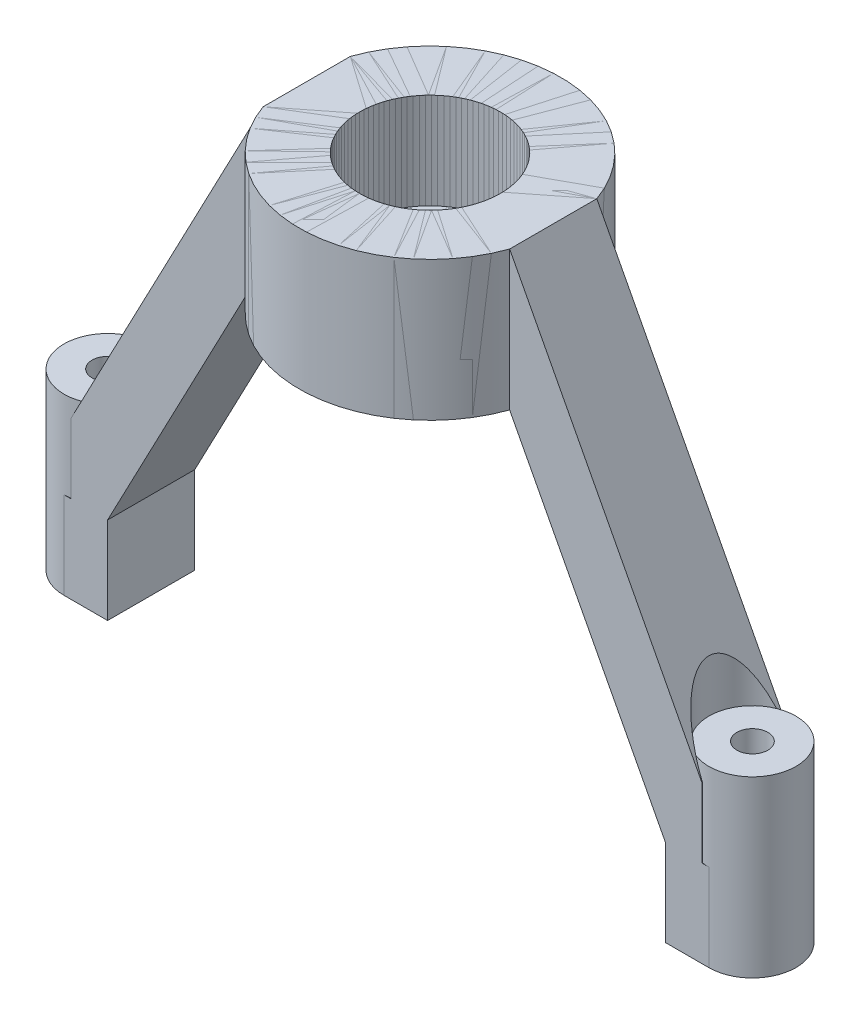
ISO-10303-21;
HEADER;
FILE_DESCRIPTION(('STEP AP214'),'2;1');
FILE_NAME('part.step','',(''),(''),'','','');
FILE_SCHEMA(('AUTOMOTIVE_DESIGN { 1 0 10303 214 1 1 1 1 }'));
ENDSEC;
DATA;
#1=APPLICATION_CONTEXT('core data for automotive mechanical design processes');
#2=APPLICATION_PROTOCOL_DEFINITION('international standard','automotive_design',2000,#1);
#3=PRODUCT_CONTEXT('',#1,'mechanical');
#4=PRODUCT('Part','Part','',(#3));
#5=PRODUCT_RELATED_PRODUCT_CATEGORY('part','',(#4));
#6=PRODUCT_DEFINITION_FORMATION('','',#4);
#7=PRODUCT_DEFINITION_CONTEXT('part definition',#1,'design');
#8=PRODUCT_DEFINITION('design','',#6,#7);
#9=PRODUCT_DEFINITION_SHAPE('','',#8);
#10=(LENGTH_UNIT() NAMED_UNIT(*) SI_UNIT(.MILLI.,.METRE.));
#11=(NAMED_UNIT(*) PLANE_ANGLE_UNIT() SI_UNIT($,.RADIAN.));
#12=(NAMED_UNIT(*) SI_UNIT($,.STERADIAN.) SOLID_ANGLE_UNIT());
#13=UNCERTAINTY_MEASURE_WITH_UNIT(LENGTH_MEASURE(1.E-05),#10,'distance_accuracy_value','');
#14=(GEOMETRIC_REPRESENTATION_CONTEXT(3) GLOBAL_UNCERTAINTY_ASSIGNED_CONTEXT((#13)) GLOBAL_UNIT_ASSIGNED_CONTEXT((#10,
#11,#12)) REPRESENTATION_CONTEXT('',''));
#15=CARTESIAN_POINT('',(0.,0.,0.));
#16=DIRECTION('',(0.,0.,1.));
#17=DIRECTION('',(1.,0.,0.));
#18=AXIS2_PLACEMENT_3D('',#15,#16,#17);
#19=CARTESIAN_POINT('',(7.07106781186548,8.,2.5));
#20=DIRECTION('',(0.885313609398567,0.464994422561907,0.));
#21=DIRECTION('',(0.464994422561907,-0.885313609398567,0.));
#22=AXIS2_PLACEMENT_3D('',#19,#20,#21);
#23=PLANE('',#22);
#24=CARTESIAN_POINT('',(18.5,-13.7598076796324,0.));
#25=DIRECTION('',(0.885313609398567,0.464994422561907,0.));
#26=DIRECTION('',(0.464994422561907,-0.885313609398567,0.));
#27=AXIS2_PLACEMENT_3D('',#24,#25,#26);
#28=ELLIPSE('',#27,5.37640857330318,2.5);
#29=CARTESIAN_POINT('',(17.5756939155531,-12.,2.32285562664892));
#30=VERTEX_POINT('',#29);
#31=CARTESIAN_POINT('',(18.0982681457173,-12.9949411335653,2.467511199013));
#32=VERTEX_POINT('',#31);
#33=EDGE_CURVE('E477',#30,#32,#28,.T.);
#34=ORIENTED_EDGE('',*,*,#33,.F.);
#35=CARTESIAN_POINT('',(18.5,-13.7598076796324,0.));
#36=DIRECTION('',(0.885313609398567,0.464994422561907,0.));
#37=DIRECTION('',(0.464994422561907,-0.885313609398567,0.));
#38=AXIS2_PLACEMENT_3D('',#35,#36,#37);
#39=ELLIPSE('',#38,5.37640857330318,2.5);
#40=CARTESIAN_POINT('',(17.5756939155531,-12.,-2.32285562664892));
#41=VERTEX_POINT('',#40);
#42=EDGE_CURVE('E12',#30,#41,#39,.F.);
#43=ORIENTED_EDGE('',*,*,#42,.T.);
#44=CARTESIAN_POINT('',(18.0982681457173,-12.9949411335653,-2.467511199013));
#45=VERTEX_POINT('',#44);
#46=EDGE_CURVE('E475',#45,#41,#28,.T.);
#47=ORIENTED_EDGE('',*,*,#46,.F.);
#48=DIRECTION('',(0.,0.,-1.));
#49=VECTOR('',#48,1.);
#50=CARTESIAN_POINT('',(18.0982681457173,-12.9949411335653,2.5));
#51=LINE('',#50,#49);
#52=CARTESIAN_POINT('',(18.0982681457173,-12.9949411335653,-2.5));
#53=VERTEX_POINT('',#52);
#54=EDGE_CURVE('E490',#45,#53,#51,.T.);
#55=ORIENTED_EDGE('',*,*,#54,.T.);
#56=DIRECTION('',(0.464994422561907,-0.885313609398567,0.));
#57=VECTOR('',#56,1.);
#58=CARTESIAN_POINT('',(7.07106781186548,8.,-2.5));
#59=LINE('',#58,#57);
#60=CARTESIAN_POINT('',(7.07106781186548,8.,-2.5));
#61=VERTEX_POINT('',#60);
#62=EDGE_CURVE('E495',#61,#53,#59,.T.);
#63=ORIENTED_EDGE('',*,*,#62,.F.);
#64=DIRECTION('',(0.,0.,-1.));
#65=VECTOR('',#64,1.);
#66=CARTESIAN_POINT('',(7.07106781186548,8.,2.5));
#67=LINE('',#66,#65);
#68=CARTESIAN_POINT('',(7.07106781186548,8.,2.5));
#69=VERTEX_POINT('',#68);
#70=EDGE_CURVE('E206',#69,#61,#67,.T.);
#71=ORIENTED_EDGE('',*,*,#70,.F.);
#72=DIRECTION('',(0.464994422561907,-0.885313609398567,0.));
#73=VECTOR('',#72,1.);
#74=CARTESIAN_POINT('',(7.07106781186548,8.,2.5));
#75=LINE('',#74,#73);
#76=CARTESIAN_POINT('',(18.0982681457173,-12.9949411335653,2.5));
#77=VERTEX_POINT('',#76);
#78=EDGE_CURVE('E201',#69,#77,#75,.T.);
#79=ORIENTED_EDGE('',*,*,#78,.T.);
#80=EDGE_CURVE('E185',#77,#32,#51,.T.);
#81=ORIENTED_EDGE('',*,*,#80,.T.);
#82=EDGE_LOOP('',(#34,#43,#47,#55,#63,#71,#79,#81));
#83=FACE_BOUND('',#82,.T.);
#84=ADVANCED_FACE('F45',(#83),#23,.T.);
#85=CARTESIAN_POINT('',(18.5,-12.,0.));
#86=DIRECTION('',(0.,-1.,0.));
#87=DIRECTION('',(0.,0.,1.));
#88=AXIS2_PLACEMENT_3D('',#85,#86,#87);
#89=CYLINDRICAL_SURFACE('',#88,0.889);
#90=CARTESIAN_POINT('',(18.5,-12.,0.));
#91=DIRECTION('',(0.,1.,0.));
#92=DIRECTION('',(0.,0.,-1.));
#93=AXIS2_PLACEMENT_3D('',#90,#91,#92);
#94=CIRCLE('',#93,0.889);
#95=CARTESIAN_POINT('',(18.5,-12.,-0.889));
#96=VERTEX_POINT('',#95);
#97=EDGE_CURVE('E479',#96,#96,#94,.T.);
#98=ORIENTED_EDGE('',*,*,#97,.T.);
#99=EDGE_LOOP('',(#98));
#100=FACE_BOUND('',#99,.T.);
#101=CARTESIAN_POINT('',(18.5,-22.,0.));
#102=DIRECTION('',(0.,-1.,0.));
#103=DIRECTION('',(0.,0.,1.));
#104=AXIS2_PLACEMENT_3D('',#101,#102,#103);
#105=CIRCLE('',#104,0.889);
#106=CARTESIAN_POINT('',(18.5,-22.,0.889));
#107=VERTEX_POINT('',#106);
#108=EDGE_CURVE('E242',#107,#107,#105,.T.);
#109=ORIENTED_EDGE('',*,*,#108,.T.);
#110=EDGE_LOOP('',(#109));
#111=FACE_BOUND('',#110,.T.);
#112=ADVANCED_FACE('F47',(#100,#111),#89,.F.);
#113=CARTESIAN_POINT('',(18.5,-12.,0.));
#114=DIRECTION('',(0.,-1.,0.));
#115=DIRECTION('',(0.,0.,1.));
#116=AXIS2_PLACEMENT_3D('',#113,#114,#115);
#117=CYLINDRICAL_SURFACE('',#116,2.5);
#118=CARTESIAN_POINT('',(18.5,-17.,0.));
#119=DIRECTION('',(0.,1.,0.));
#120=DIRECTION('',(0.,0.,-1.));
#121=AXIS2_PLACEMENT_3D('',#118,#119,#120);
#122=CIRCLE('',#121,2.5);
#123=CARTESIAN_POINT('',(18.0982681457173,-17.,2.467511199013));
#124=VERTEX_POINT('',#123);
#125=CARTESIAN_POINT('',(18.5,-17.,2.5));
#126=VERTEX_POINT('',#125);
#127=EDGE_CURVE('E70',#124,#126,#122,.T.);
#128=ORIENTED_EDGE('',*,*,#127,.T.);
#129=DIRECTION('',(0.,1.,0.));
#130=VECTOR('',#129,1.);
#131=CARTESIAN_POINT('',(18.5,-22.,2.5));
#132=LINE('',#131,#130);
#133=CARTESIAN_POINT('',(18.5,-22.,2.5));
#134=VERTEX_POINT('',#133);
#135=EDGE_CURVE('E148',#134,#126,#132,.T.);
#136=ORIENTED_EDGE('',*,*,#135,.F.);
#137=CARTESIAN_POINT('',(18.5,-22.,0.));
#138=DIRECTION('',(0.,-1.,0.));
#139=DIRECTION('',(0.,0.,1.));
#140=AXIS2_PLACEMENT_3D('',#137,#138,#139);
#141=CIRCLE('',#140,2.5);
#142=CARTESIAN_POINT('',(18.5,-22.,-2.5));
#143=VERTEX_POINT('',#142);
#144=EDGE_CURVE('E154',#143,#134,#141,.T.);
#145=ORIENTED_EDGE('',*,*,#144,.F.);
#146=DIRECTION('',(0.,1.,0.));
#147=VECTOR('',#146,1.);
#148=CARTESIAN_POINT('',(18.5,-22.,-2.5));
#149=LINE('',#148,#147);
#150=CARTESIAN_POINT('',(18.5,-17.,-2.5));
#151=VERTEX_POINT('',#150);
#152=EDGE_CURVE('E178',#143,#151,#149,.T.);
#153=ORIENTED_EDGE('',*,*,#152,.T.);
#154=CARTESIAN_POINT('',(18.0982681457173,-17.,-2.467511199013));
#155=VERTEX_POINT('',#154);
#156=EDGE_CURVE('E62',#151,#155,#122,.T.);
#157=ORIENTED_EDGE('',*,*,#156,.T.);
#158=DIRECTION('',(0.,-1.,0.));
#159=VECTOR('',#158,1.);
#160=CARTESIAN_POINT('',(18.0982681457173,-12.,-2.467511199013));
#161=LINE('',#160,#159);
#162=EDGE_CURVE('E219',#155,#45,#161,.F.);
#163=ORIENTED_EDGE('',*,*,#162,.T.);
#164=ORIENTED_EDGE('',*,*,#46,.T.);
#165=CARTESIAN_POINT('',(18.5,-12.,0.));
#166=DIRECTION('',(0.,1.,0.));
#167=DIRECTION('',(0.,0.,-1.));
#168=AXIS2_PLACEMENT_3D('',#165,#166,#167);
#169=CIRCLE('',#168,2.5);
#170=EDGE_CURVE('E54',#30,#41,#169,.T.);
#171=ORIENTED_EDGE('',*,*,#170,.F.);
#172=ORIENTED_EDGE('',*,*,#33,.T.);
#173=DIRECTION('',(0.,-1.,0.));
#174=VECTOR('',#173,1.);
#175=CARTESIAN_POINT('',(18.0982681457173,-12.,2.467511199013));
#176=LINE('',#175,#174);
#177=EDGE_CURVE('E223',#32,#124,#176,.T.);
#178=ORIENTED_EDGE('',*,*,#177,.T.);
#179=EDGE_LOOP('',(#128,#136,#145,#153,#157,#163,#164,#171,#172,#178));
#180=FACE_BOUND('',#179,.T.);
#181=ADVANCED_FACE('F165',(#180),#117,.T.);
#182=CARTESIAN_POINT('',(0.,-12.,0.));
#183=DIRECTION('',(0.,1.,0.));
#184=DIRECTION('',(0.,0.,-1.));
#185=AXIS2_PLACEMENT_3D('',#182,#183,#184);
#186=PLANE('',#185);
#187=ORIENTED_EDGE('',*,*,#170,.T.);
#188=CARTESIAN_POINT('',(18.5,-12.,0.));
#189=DIRECTION('',(0.,1.,0.));
#190=DIRECTION('',(0.,0.,-1.));
#191=AXIS2_PLACEMENT_3D('',#188,#189,#190);
#192=CIRCLE('',#191,2.5);
#193=EDGE_CURVE('E166',#41,#30,#192,.T.);
#194=ORIENTED_EDGE('',*,*,#193,.T.);
#195=EDGE_LOOP('',(#187,#194));
#196=FACE_BOUND('',#195,.T.);
#197=ORIENTED_EDGE('',*,*,#97,.F.);
#198=EDGE_LOOP('',(#197));
#199=FACE_BOUND('',#198,.T.);
#200=ADVANCED_FACE('F273',(#196,#199),#186,.T.);
#201=CARTESIAN_POINT('',(0.,0.,-2.5));
#202=DIRECTION('',(0.,0.,1.));
#203=DIRECTION('',(1.,0.,0.));
#204=AXIS2_PLACEMENT_3D('',#201,#202,#203);
#205=PLANE('',#204);
#206=DIRECTION('',(0.,1.,0.));
#207=VECTOR('',#206,1.);
#208=CARTESIAN_POINT('',(7.07106781186548,0.,-2.5));
#209=LINE('',#208,#207);
#210=CARTESIAN_POINT('',(7.07106781186548,0.,-2.5));
#211=VERTEX_POINT('',#210);
#212=EDGE_CURVE('E522',#211,#61,#209,.T.);
#213=ORIENTED_EDGE('',*,*,#212,.T.);
#214=ORIENTED_EDGE('',*,*,#62,.T.);
#215=DIRECTION('',(0.,-1.,0.));
#216=VECTOR('',#215,1.);
#217=CARTESIAN_POINT('',(18.0982681457173,-12.9949411335653,-2.5));
#218=LINE('',#217,#216);
#219=CARTESIAN_POINT('',(18.0982681457173,-17.,-2.5));
#220=VERTEX_POINT('',#219);
#221=EDGE_CURVE('E186',#53,#220,#218,.T.);
#222=ORIENTED_EDGE('',*,*,#221,.T.);
#223=DIRECTION('',(1.,0.,0.));
#224=VECTOR('',#223,1.);
#225=CARTESIAN_POINT('',(16.,-17.,-2.5));
#226=LINE('',#225,#224);
#227=EDGE_CURVE('E163',#220,#151,#226,.T.);
#228=ORIENTED_EDGE('',*,*,#227,.T.);
#229=ORIENTED_EDGE('',*,*,#152,.F.);
#230=DIRECTION('',(1.,0.,0.));
#231=VECTOR('',#230,1.);
#232=CARTESIAN_POINT('',(16.,-22.,-2.5));
#233=LINE('',#232,#231);
#234=CARTESIAN_POINT('',(16.,-22.,-2.5));
#235=VERTEX_POINT('',#234);
#236=EDGE_CURVE('E160',#235,#143,#233,.T.);
#237=ORIENTED_EDGE('',*,*,#236,.F.);
#238=DIRECTION('',(0.,1.,0.));
#239=VECTOR('',#238,1.);
#240=CARTESIAN_POINT('',(16.,-22.,-2.5));
#241=LINE('',#240,#239);
#242=CARTESIAN_POINT('',(16.,-17.,-2.5));
#243=VERTEX_POINT('',#242);
#244=EDGE_CURVE('E170',#235,#243,#241,.T.);
#245=ORIENTED_EDGE('',*,*,#244,.T.);
#246=DIRECTION('',(-0.464994422561907,0.885313609398567,0.));
#247=VECTOR('',#246,1.);
#248=CARTESIAN_POINT('',(16.,-17.,-2.5));
#249=LINE('',#248,#247);
#250=EDGE_CURVE('E215',#243,#211,#249,.T.);
#251=ORIENTED_EDGE('',*,*,#250,.T.);
#252=EDGE_LOOP('',(#213,#214,#222,#228,#229,#237,#245,#251));
#253=FACE_BOUND('',#252,.T.);
#254=ADVANCED_FACE('F233',(#253),#205,.F.);
#255=CARTESIAN_POINT('',(0.,0.,2.5));
#256=DIRECTION('',(0.,0.,1.));
#257=DIRECTION('',(1.,0.,0.));
#258=AXIS2_PLACEMENT_3D('',#255,#256,#257);
#259=PLANE('',#258);
#260=DIRECTION('',(0.,1.,0.));
#261=VECTOR('',#260,1.);
#262=CARTESIAN_POINT('',(7.07106781186548,0.,2.5));
#263=LINE('',#262,#261);
#264=CARTESIAN_POINT('',(7.07106781186548,0.,2.5));
#265=VERTEX_POINT('',#264);
#266=EDGE_CURVE('E209',#265,#69,#263,.T.);
#267=ORIENTED_EDGE('',*,*,#266,.F.);
#268=DIRECTION('',(-0.464994422561907,0.885313609398567,0.));
#269=VECTOR('',#268,1.);
#270=CARTESIAN_POINT('',(16.,-17.,2.5));
#271=LINE('',#270,#269);
#272=CARTESIAN_POINT('',(16.,-17.,2.5));
#273=VERTEX_POINT('',#272);
#274=EDGE_CURVE('E200',#273,#265,#271,.T.);
#275=ORIENTED_EDGE('',*,*,#274,.F.);
#276=DIRECTION('',(0.,1.,0.));
#277=VECTOR('',#276,1.);
#278=CARTESIAN_POINT('',(16.,-22.,2.5));
#279=LINE('',#278,#277);
#280=CARTESIAN_POINT('',(16.,-22.,2.5));
#281=VERTEX_POINT('',#280);
#282=EDGE_CURVE('E150',#281,#273,#279,.T.);
#283=ORIENTED_EDGE('',*,*,#282,.F.);
#284=DIRECTION('',(-1.,0.,0.));
#285=VECTOR('',#284,1.);
#286=CARTESIAN_POINT('',(18.5,-22.,2.5));
#287=LINE('',#286,#285);
#288=EDGE_CURVE('E144',#134,#281,#287,.T.);
#289=ORIENTED_EDGE('',*,*,#288,.F.);
#290=ORIENTED_EDGE('',*,*,#135,.T.);
#291=DIRECTION('',(-1.,0.,0.));
#292=VECTOR('',#291,1.);
#293=CARTESIAN_POINT('',(18.5,-17.,2.5));
#294=LINE('',#293,#292);
#295=CARTESIAN_POINT('',(18.0982681457173,-17.,2.5));
#296=VERTEX_POINT('',#295);
#297=EDGE_CURVE('E241',#126,#296,#294,.T.);
#298=ORIENTED_EDGE('',*,*,#297,.T.);
#299=DIRECTION('',(0.,-1.,0.));
#300=VECTOR('',#299,1.);
#301=CARTESIAN_POINT('',(18.0982681457173,-12.9949411335653,2.5));
#302=LINE('',#301,#300);
#303=EDGE_CURVE('E199',#77,#296,#302,.T.);
#304=ORIENTED_EDGE('',*,*,#303,.F.);
#305=ORIENTED_EDGE('',*,*,#78,.F.);
#306=EDGE_LOOP('',(#267,#275,#283,#289,#290,#298,#304,#305));
#307=FACE_BOUND('',#306,.T.);
#308=ADVANCED_FACE('F146',(#307),#259,.T.);
#309=CARTESIAN_POINT('',(16.,-17.,2.5));
#310=DIRECTION('',(-0.885313609398567,-0.464994422561907,0.));
#311=DIRECTION('',(-0.464994422561907,0.885313609398567,0.));
#312=AXIS2_PLACEMENT_3D('',#309,#310,#311);
#313=PLANE('',#312);
#314=DIRECTION('',(0.,0.,-1.));
#315=VECTOR('',#314,1.);
#316=CARTESIAN_POINT('',(7.07106781186548,0.,2.5));
#317=LINE('',#316,#315);
#318=EDGE_CURVE('E218',#265,#211,#317,.T.);
#319=ORIENTED_EDGE('',*,*,#318,.T.);
#320=ORIENTED_EDGE('',*,*,#250,.F.);
#321=DIRECTION('',(0.,0.,-1.));
#322=VECTOR('',#321,1.);
#323=CARTESIAN_POINT('',(16.,-17.,2.5));
#324=LINE('',#323,#322);
#325=EDGE_CURVE('E190',#273,#243,#324,.T.);
#326=ORIENTED_EDGE('',*,*,#325,.F.);
#327=ORIENTED_EDGE('',*,*,#274,.T.);
#328=EDGE_LOOP('',(#319,#320,#326,#327));
#329=FACE_BOUND('',#328,.T.);
#330=ADVANCED_FACE('F297',(#329),#313,.T.);
#331=CARTESIAN_POINT('',(18.0982681457173,-12.9949411335653,2.5));
#332=DIRECTION('',(1.,0.,0.));
#333=DIRECTION('',(0.,0.,-1.));
#334=AXIS2_PLACEMENT_3D('',#331,#332,#333);
#335=PLANE('',#334);
#336=ORIENTED_EDGE('',*,*,#162,.F.);
#337=DIRECTION('',(0.,0.,-1.));
#338=VECTOR('',#337,1.);
#339=CARTESIAN_POINT('',(18.0982681457173,-17.,2.5));
#340=LINE('',#339,#338);
#341=EDGE_CURVE('E182',#155,#220,#340,.T.);
#342=ORIENTED_EDGE('',*,*,#341,.T.);
#343=ORIENTED_EDGE('',*,*,#221,.F.);
#344=ORIENTED_EDGE('',*,*,#54,.F.);
#345=EDGE_LOOP('',(#336,#342,#343,#344));
#346=FACE_BOUND('',#345,.T.);
#347=ADVANCED_FACE('F304',(#346),#335,.T.);
#348=ORIENTED_EDGE('',*,*,#177,.F.);
#349=ORIENTED_EDGE('',*,*,#80,.F.);
#350=ORIENTED_EDGE('',*,*,#303,.T.);
#351=EDGE_CURVE('E184',#296,#124,#340,.T.);
#352=ORIENTED_EDGE('',*,*,#351,.T.);
#353=EDGE_LOOP('',(#348,#349,#350,#352));
#354=FACE_BOUND('',#353,.T.);
#355=ADVANCED_FACE('F271',(#354),#335,.T.);
#356=CARTESIAN_POINT('',(0.,8.,0.));
#357=DIRECTION('',(0.,-1.,0.));
#358=DIRECTION('',(0.,0.,1.));
#359=AXIS2_PLACEMENT_3D('',#356,#357,#358);
#360=CYLINDRICAL_SURFACE('',#359,1.875);
#361=CARTESIAN_POINT('',(0.,0.,0.));
#362=DIRECTION('',(0.,1.,0.));
#363=DIRECTION('',(0.,0.,-1.));
#364=AXIS2_PLACEMENT_3D('',#361,#362,#363);
#365=CIRCLE('',#364,1.875);
#366=CARTESIAN_POINT('',(0.,0.,-1.875));
#367=VERTEX_POINT('',#366);
#368=EDGE_CURVE('E515',#367,#367,#365,.T.);
#369=ORIENTED_EDGE('',*,*,#368,.F.);
#370=EDGE_LOOP('',(#369));
#371=FACE_BOUND('',#370,.T.);
#372=CARTESIAN_POINT('',(0.,2.5,0.));
#373=DIRECTION('',(0.,1.,0.));
#374=DIRECTION('',(0.,0.,-1.));
#375=AXIS2_PLACEMENT_3D('',#372,#373,#374);
#376=CIRCLE('',#375,1.875);
#377=CARTESIAN_POINT('',(0.,2.5,-1.875));
#378=VERTEX_POINT('',#377);
#379=EDGE_CURVE('E523',#378,#378,#376,.T.);
#380=ORIENTED_EDGE('',*,*,#379,.T.);
#381=EDGE_LOOP('',(#380));
#382=FACE_BOUND('',#381,.T.);
#383=ADVANCED_FACE('F316',(#371,#382),#360,.F.);
#384=CARTESIAN_POINT('',(-7.07106781186548,8.,0.));
#385=DIRECTION('',(-1.,0.,0.));
#386=DIRECTION('',(0.,0.,1.));
#387=AXIS2_PLACEMENT_3D('',#384,#385,#386);
#388=PLANE('',#387);
#389=DIRECTION('',(0.,0.,-1.));
#390=VECTOR('',#389,1.);
#391=CARTESIAN_POINT('',(-7.07106781186548,0.,0.));
#392=LINE('',#391,#390);
#393=CARTESIAN_POINT('',(-7.07106781186548,0.,2.5));
#394=VERTEX_POINT('',#393);
#395=CARTESIAN_POINT('',(-7.07106781186548,0.,-2.5));
#396=VERTEX_POINT('',#395);
#397=EDGE_CURVE('E511',#394,#396,#392,.T.);
#398=ORIENTED_EDGE('',*,*,#397,.F.);
#399=DIRECTION('',(0.,-1.,0.));
#400=VECTOR('',#399,1.);
#401=CARTESIAN_POINT('',(-7.07106781186548,8.,2.5));
#402=LINE('',#401,#400);
#403=CARTESIAN_POINT('',(-7.07106781186548,8.,2.5));
#404=VERTEX_POINT('',#403);
#405=EDGE_CURVE('E506',#404,#394,#402,.T.);
#406=ORIENTED_EDGE('',*,*,#405,.F.);
#407=DIRECTION('',(0.,0.,-1.));
#408=VECTOR('',#407,1.);
#409=CARTESIAN_POINT('',(-7.07106781186548,8.,0.));
#410=LINE('',#409,#408);
#411=CARTESIAN_POINT('',(-7.07106781186548,8.,-2.5));
#412=VERTEX_POINT('',#411);
#413=EDGE_CURVE('E500',#404,#412,#410,.T.);
#414=ORIENTED_EDGE('',*,*,#413,.T.);
#415=DIRECTION('',(0.,-1.,0.));
#416=VECTOR('',#415,1.);
#417=CARTESIAN_POINT('',(-7.07106781186548,8.,-2.5));
#418=LINE('',#417,#416);
#419=EDGE_CURVE('E519',#412,#396,#418,.T.);
#420=ORIENTED_EDGE('',*,*,#419,.T.);
#421=EDGE_LOOP('',(#398,#406,#414,#420));
#422=FACE_BOUND('',#421,.T.);
#423=ADVANCED_FACE('F322',(#422),#388,.T.);
#424=CARTESIAN_POINT('',(0.,8.,0.));
#425=DIRECTION('',(0.,-1.,0.));
#426=DIRECTION('',(0.,0.,1.));
#427=AXIS2_PLACEMENT_3D('',#424,#425,#426);
#428=CYLINDRICAL_SURFACE('',#427,7.5);
#429=CARTESIAN_POINT('',(0.,0.,0.));
#430=DIRECTION('',(0.,1.,0.));
#431=DIRECTION('',(0.,0.,-1.));
#432=AXIS2_PLACEMENT_3D('',#429,#430,#431);
#433=CIRCLE('',#432,7.5);
#434=EDGE_CURVE('E505',#394,#265,#433,.T.);
#435=ORIENTED_EDGE('',*,*,#434,.T.);
#436=ORIENTED_EDGE('',*,*,#266,.T.);
#437=CARTESIAN_POINT('',(0.,8.,0.));
#438=DIRECTION('',(0.,1.,0.));
#439=DIRECTION('',(0.,0.,-1.));
#440=AXIS2_PLACEMENT_3D('',#437,#438,#439);
#441=CIRCLE('',#440,7.5);
#442=EDGE_CURVE('E498',#404,#69,#441,.T.);
#443=ORIENTED_EDGE('',*,*,#442,.F.);
#444=ORIENTED_EDGE('',*,*,#405,.T.);
#445=EDGE_LOOP('',(#435,#436,#443,#444));
#446=FACE_BOUND('',#445,.T.);
#447=ADVANCED_FACE('F330',(#446),#428,.T.);
#448=CARTESIAN_POINT('',(0.,8.,0.));
#449=DIRECTION('',(0.,-1.,0.));
#450=DIRECTION('',(0.,0.,1.));
#451=AXIS2_PLACEMENT_3D('',#448,#449,#450);
#452=CYLINDRICAL_SURFACE('',#451,7.5);
#453=CARTESIAN_POINT('',(0.,0.,0.));
#454=DIRECTION('',(0.,1.,0.));
#455=DIRECTION('',(0.,0.,-1.));
#456=AXIS2_PLACEMENT_3D('',#453,#454,#455);
#457=CIRCLE('',#456,7.5);
#458=EDGE_CURVE('E510',#211,#396,#457,.T.);
#459=ORIENTED_EDGE('',*,*,#458,.T.);
#460=ORIENTED_EDGE('',*,*,#419,.F.);
#461=CARTESIAN_POINT('',(0.,8.,0.));
#462=DIRECTION('',(0.,1.,0.));
#463=DIRECTION('',(0.,0.,-1.));
#464=AXIS2_PLACEMENT_3D('',#461,#462,#463);
#465=CIRCLE('',#464,7.5);
#466=EDGE_CURVE('E501',#61,#412,#465,.T.);
#467=ORIENTED_EDGE('',*,*,#466,.F.);
#468=ORIENTED_EDGE('',*,*,#212,.F.);
#469=EDGE_LOOP('',(#459,#460,#467,#468));
#470=FACE_BOUND('',#469,.T.);
#471=ADVANCED_FACE('F338',(#470),#452,.T.);
#472=CARTESIAN_POINT('',(0.,8.,0.));
#473=DIRECTION('',(0.,1.,0.));
#474=DIRECTION('',(0.,0.,-1.));
#475=AXIS2_PLACEMENT_3D('',#472,#473,#474);
#476=PLANE('',#475);
#477=CARTESIAN_POINT('',(0.,8.,0.));
#478=DIRECTION('',(0.,1.,0.));
#479=DIRECTION('',(0.,0.,-1.));
#480=AXIS2_PLACEMENT_3D('',#477,#478,#479);
#481=CIRCLE('',#480,4.05);
#482=CARTESIAN_POINT('',(0.,8.,-4.05));
#483=VERTEX_POINT('',#482);
#484=EDGE_CURVE('E168',#483,#483,#481,.T.);
#485=ORIENTED_EDGE('',*,*,#484,.F.);
#486=EDGE_LOOP('',(#485));
#487=FACE_BOUND('',#486,.T.);
#488=ORIENTED_EDGE('',*,*,#413,.F.);
#489=ORIENTED_EDGE('',*,*,#442,.T.);
#490=ORIENTED_EDGE('',*,*,#70,.T.);
#491=ORIENTED_EDGE('',*,*,#466,.T.);
#492=EDGE_LOOP('',(#488,#489,#490,#491));
#493=FACE_BOUND('',#492,.T.);
#494=ADVANCED_FACE('F346',(#487,#493),#476,.T.);
#495=CARTESIAN_POINT('',(0.,0.,0.));
#496=DIRECTION('',(0.,1.,0.));
#497=DIRECTION('',(0.,0.,-1.));
#498=AXIS2_PLACEMENT_3D('',#495,#496,#497);
#499=PLANE('',#498);
#500=ORIENTED_EDGE('',*,*,#368,.T.);
#501=EDGE_LOOP('',(#500));
#502=FACE_BOUND('',#501,.T.);
#503=ORIENTED_EDGE('',*,*,#397,.T.);
#504=ORIENTED_EDGE('',*,*,#458,.F.);
#505=ORIENTED_EDGE('',*,*,#318,.F.);
#506=ORIENTED_EDGE('',*,*,#434,.F.);
#507=EDGE_LOOP('',(#503,#504,#505,#506));
#508=FACE_BOUND('',#507,.T.);
#509=ADVANCED_FACE('F354',(#502,#508),#499,.F.);
#510=CARTESIAN_POINT('',(0.,2.5,0.));
#511=DIRECTION('',(0.,1.,0.));
#512=DIRECTION('',(0.,0.,-1.));
#513=AXIS2_PLACEMENT_3D('',#510,#511,#512);
#514=CYLINDRICAL_SURFACE('',#513,4.05);
#515=CARTESIAN_POINT('',(0.,2.5,0.));
#516=DIRECTION('',(0.,1.,0.));
#517=DIRECTION('',(0.,0.,-1.));
#518=AXIS2_PLACEMENT_3D('',#515,#516,#517);
#519=CIRCLE('',#518,4.05);
#520=CARTESIAN_POINT('',(0.,2.5,-4.05));
#521=VERTEX_POINT('',#520);
#522=EDGE_CURVE('E526',#521,#521,#519,.T.);
#523=ORIENTED_EDGE('',*,*,#522,.F.);
#524=EDGE_LOOP('',(#523));
#525=FACE_BOUND('',#524,.T.);
#526=ORIENTED_EDGE('',*,*,#484,.T.);
#527=EDGE_LOOP('',(#526));
#528=FACE_BOUND('',#527,.T.);
#529=ADVANCED_FACE('F362',(#525,#528),#514,.F.);
#530=CARTESIAN_POINT('',(0.,2.5,0.));
#531=DIRECTION('',(0.,1.,0.));
#532=DIRECTION('',(0.,0.,-1.));
#533=AXIS2_PLACEMENT_3D('',#530,#531,#532);
#534=PLANE('',#533);
#535=ORIENTED_EDGE('',*,*,#379,.F.);
#536=EDGE_LOOP('',(#535));
#537=FACE_BOUND('',#536,.T.);
#538=ORIENTED_EDGE('',*,*,#522,.T.);
#539=EDGE_LOOP('',(#538));
#540=FACE_BOUND('',#539,.T.);
#541=ADVANCED_FACE('F370',(#537,#540),#534,.T.);
#542=CARTESIAN_POINT('',(18.5,8.,0.));
#543=DIRECTION('',(0.,-1.,0.));
#544=DIRECTION('',(0.,0.,1.));
#545=AXIS2_PLACEMENT_3D('',#542,#543,#544);
#546=CYLINDRICAL_SURFACE('',#545,2.5);
#547=ORIENTED_EDGE('',*,*,#193,.F.);
#548=ORIENTED_EDGE('',*,*,#42,.F.);
#549=EDGE_LOOP('',(#547,#548));
#550=FACE_BOUND('',#549,.T.);
#551=ADVANCED_FACE('F260',(#550),#546,.F.);
#552=CARTESIAN_POINT('',(18.5,-17.,0.));
#553=DIRECTION('',(0.,-1.,0.));
#554=DIRECTION('',(0.,0.,1.));
#555=AXIS2_PLACEMENT_3D('',#552,#553,#554);
#556=PLANE('',#555);
#557=ORIENTED_EDGE('',*,*,#127,.F.);
#558=ORIENTED_EDGE('',*,*,#351,.F.);
#559=ORIENTED_EDGE('',*,*,#297,.F.);
#560=EDGE_LOOP('',(#557,#558,#559));
#561=FACE_BOUND('',#560,.T.);
#562=ADVANCED_FACE('F253',(#561),#556,.F.);
#563=CARTESIAN_POINT('',(18.5,-22.,0.));
#564=DIRECTION('',(0.,-1.,0.));
#565=DIRECTION('',(0.,0.,1.));
#566=AXIS2_PLACEMENT_3D('',#563,#564,#565);
#567=PLANE('',#566);
#568=ORIENTED_EDGE('',*,*,#144,.T.);
#569=ORIENTED_EDGE('',*,*,#288,.T.);
#570=DIRECTION('',(0.,0.,-1.));
#571=VECTOR('',#570,1.);
#572=CARTESIAN_POINT('',(16.,-22.,2.5));
#573=LINE('',#572,#571);
#574=EDGE_CURVE('E153',#281,#235,#573,.T.);
#575=ORIENTED_EDGE('',*,*,#574,.T.);
#576=ORIENTED_EDGE('',*,*,#236,.T.);
#577=EDGE_LOOP('',(#568,#569,#575,#576));
#578=FACE_BOUND('',#577,.T.);
#579=ORIENTED_EDGE('',*,*,#108,.F.);
#580=EDGE_LOOP('',(#579));
#581=FACE_BOUND('',#580,.T.);
#582=ADVANCED_FACE('F157',(#578,#581),#567,.T.);
#583=ORIENTED_EDGE('',*,*,#156,.F.);
#584=ORIENTED_EDGE('',*,*,#227,.F.);
#585=ORIENTED_EDGE('',*,*,#341,.F.);
#586=EDGE_LOOP('',(#583,#584,#585));
#587=FACE_BOUND('',#586,.T.);
#588=ADVANCED_FACE('F252',(#587),#556,.F.);
#589=CARTESIAN_POINT('',(16.,-22.,2.5));
#590=DIRECTION('',(1.,0.,0.));
#591=DIRECTION('',(0.,0.,-1.));
#592=AXIS2_PLACEMENT_3D('',#589,#590,#591);
#593=PLANE('',#592);
#594=ORIENTED_EDGE('',*,*,#325,.T.);
#595=ORIENTED_EDGE('',*,*,#244,.F.);
#596=ORIENTED_EDGE('',*,*,#574,.F.);
#597=ORIENTED_EDGE('',*,*,#282,.T.);
#598=EDGE_LOOP('',(#594,#595,#596,#597));
#599=FACE_BOUND('',#598,.T.);
#600=ADVANCED_FACE('F230',(#599),#593,.F.);
#601=CLOSED_SHELL('',(#84,#112,#181,#200,#254,#308,#330,#347,#355,#383,#423,#447,#471,#494,#509,
#529,#541,#551,#562,#582,#588,#600));
#602=MANIFOLD_SOLID_BREP('B2',#601);
#603=CARTESIAN_POINT('',(-7.07106781186548,8.,-2.5));
#604=DIRECTION('',(-0.885313609398567,0.464994422561907,0.));
#605=DIRECTION('',(-0.464994422561907,-0.885313609398567,0.));
#606=AXIS2_PLACEMENT_3D('',#603,#604,#605);
#607=PLANE('',#606);
#608=CARTESIAN_POINT('',(-18.5,-13.7598076796324,0.));
#609=DIRECTION('',(-0.885313609398567,0.464994422561907,0.));
#610=DIRECTION('',(-0.464994422561907,-0.885313609398567,0.));
#611=AXIS2_PLACEMENT_3D('',#608,#609,#610);
#612=ELLIPSE('',#611,5.37640857330318,2.5);
#613=CARTESIAN_POINT('',(-17.5756939155531,-12.,-2.32285562664892));
#614=VERTEX_POINT('',#613);
#615=CARTESIAN_POINT('',(-18.0982681457173,-12.9949411335653,-2.467511199013));
#616=VERTEX_POINT('',#615);
#617=EDGE_CURVE('E981',#614,#616,#612,.T.);
#618=ORIENTED_EDGE('',*,*,#617,.F.);
#619=CARTESIAN_POINT('',(-18.5,-13.7598076796324,0.));
#620=DIRECTION('',(-0.885313609398567,0.464994422561907,0.));
#621=DIRECTION('',(-0.464994422561907,-0.885313609398567,0.));
#622=AXIS2_PLACEMENT_3D('',#619,#620,#621);
#623=ELLIPSE('',#622,5.37640857330318,2.5);
#624=CARTESIAN_POINT('',(-17.5756939155531,-12.,2.32285562664892));
#625=VERTEX_POINT('',#624);
#626=EDGE_CURVE('E43',#614,#625,#623,.F.);
#627=ORIENTED_EDGE('',*,*,#626,.T.);
#628=CARTESIAN_POINT('',(-18.0982681457173,-12.9949411335653,2.467511199013));
#629=VERTEX_POINT('',#628);
#630=EDGE_CURVE('E979',#629,#625,#612,.T.);
#631=ORIENTED_EDGE('',*,*,#630,.F.);
#632=DIRECTION('',(0.,0.,1.));
#633=VECTOR('',#632,1.);
#634=CARTESIAN_POINT('',(-18.0982681457173,-12.9949411335653,-2.5));
#635=LINE('',#634,#633);
#636=CARTESIAN_POINT('',(-18.0982681457173,-12.9949411335653,2.5));
#637=VERTEX_POINT('',#636);
#638=EDGE_CURVE('E994',#629,#637,#635,.T.);
#639=ORIENTED_EDGE('',*,*,#638,.T.);
#640=DIRECTION('',(-0.464994422561907,-0.885313609398567,0.));
#641=VECTOR('',#640,1.);
#642=CARTESIAN_POINT('',(-7.07106781186548,8.,2.5));
#643=LINE('',#642,#641);
#644=CARTESIAN_POINT('',(-7.07106781186548,8.,2.5));
#645=VERTEX_POINT('',#644);
#646=EDGE_CURVE('E999',#645,#637,#643,.T.);
#647=ORIENTED_EDGE('',*,*,#646,.F.);
#648=DIRECTION('',(0.,0.,1.));
#649=VECTOR('',#648,1.);
#650=CARTESIAN_POINT('',(-7.07106781186548,8.,-2.5));
#651=LINE('',#650,#649);
#652=CARTESIAN_POINT('',(-7.07106781186548,8.,-2.5));
#653=VERTEX_POINT('',#652);
#654=EDGE_CURVE('E710',#653,#645,#651,.T.);
#655=ORIENTED_EDGE('',*,*,#654,.F.);
#656=DIRECTION('',(-0.464994422561907,-0.885313609398567,0.));
#657=VECTOR('',#656,1.);
#658=CARTESIAN_POINT('',(-7.07106781186548,8.,-2.5));
#659=LINE('',#658,#657);
#660=CARTESIAN_POINT('',(-18.0982681457173,-12.9949411335653,-2.5));
#661=VERTEX_POINT('',#660);
#662=EDGE_CURVE('E705',#653,#661,#659,.T.);
#663=ORIENTED_EDGE('',*,*,#662,.T.);
#664=EDGE_CURVE('E689',#661,#616,#635,.T.);
#665=ORIENTED_EDGE('',*,*,#664,.T.);
#666=EDGE_LOOP('',(#618,#627,#631,#639,#647,#655,#663,#665));
#667=FACE_BOUND('',#666,.T.);
#668=ADVANCED_FACE('F549',(#667),#607,.T.);
#669=CARTESIAN_POINT('',(-18.5,-12.,0.));
#670=DIRECTION('',(0.,-1.,0.));
#671=DIRECTION('',(0.,0.,-1.));
#672=AXIS2_PLACEMENT_3D('',#669,#670,#671);
#673=CYLINDRICAL_SURFACE('',#672,0.889);
#674=CARTESIAN_POINT('',(-18.5,-12.,0.));
#675=DIRECTION('',(0.,1.,0.));
#676=DIRECTION('',(0.,0.,1.));
#677=AXIS2_PLACEMENT_3D('',#674,#675,#676);
#678=CIRCLE('',#677,0.889);
#679=CARTESIAN_POINT('',(-18.5,-12.,0.889));
#680=VERTEX_POINT('',#679);
#681=EDGE_CURVE('E983',#680,#680,#678,.T.);
#682=ORIENTED_EDGE('',*,*,#681,.T.);
#683=EDGE_LOOP('',(#682));
#684=FACE_BOUND('',#683,.T.);
#685=CARTESIAN_POINT('',(-18.5,-22.,0.));
#686=DIRECTION('',(0.,-1.,0.));
#687=DIRECTION('',(0.,0.,-1.));
#688=AXIS2_PLACEMENT_3D('',#685,#686,#687);
#689=CIRCLE('',#688,0.889);
#690=CARTESIAN_POINT('',(-18.5,-22.,-0.889));
#691=VERTEX_POINT('',#690);
#692=EDGE_CURVE('E746',#691,#691,#689,.T.);
#693=ORIENTED_EDGE('',*,*,#692,.T.);
#694=EDGE_LOOP('',(#693));
#695=FACE_BOUND('',#694,.T.);
#696=ADVANCED_FACE('F551',(#684,#695),#673,.F.);
#697=CARTESIAN_POINT('',(-18.5,-12.,0.));
#698=DIRECTION('',(0.,-1.,0.));
#699=DIRECTION('',(0.,0.,-1.));
#700=AXIS2_PLACEMENT_3D('',#697,#698,#699);
#701=CYLINDRICAL_SURFACE('',#700,2.5);
#702=CARTESIAN_POINT('',(-18.5,-17.,0.));
#703=DIRECTION('',(0.,1.,0.));
#704=DIRECTION('',(0.,0.,1.));
#705=AXIS2_PLACEMENT_3D('',#702,#703,#704);
#706=CIRCLE('',#705,2.5);
#707=CARTESIAN_POINT('',(-18.0982681457173,-17.,-2.467511199013));
#708=VERTEX_POINT('',#707);
#709=CARTESIAN_POINT('',(-18.5,-17.,-2.5));
#710=VERTEX_POINT('',#709);
#711=EDGE_CURVE('E574',#708,#710,#706,.T.);
#712=ORIENTED_EDGE('',*,*,#711,.T.);
#713=DIRECTION('',(0.,1.,0.));
#714=VECTOR('',#713,1.);
#715=CARTESIAN_POINT('',(-18.5,-22.,-2.5));
#716=LINE('',#715,#714);
#717=CARTESIAN_POINT('',(-18.5,-22.,-2.5));
#718=VERTEX_POINT('',#717);
#719=EDGE_CURVE('E652',#718,#710,#716,.T.);
#720=ORIENTED_EDGE('',*,*,#719,.F.);
#721=CARTESIAN_POINT('',(-18.5,-22.,0.));
#722=DIRECTION('',(0.,-1.,0.));
#723=DIRECTION('',(0.,0.,-1.));
#724=AXIS2_PLACEMENT_3D('',#721,#722,#723);
#725=CIRCLE('',#724,2.5);
#726=CARTESIAN_POINT('',(-18.5,-22.,2.5));
#727=VERTEX_POINT('',#726);
#728=EDGE_CURVE('E658',#727,#718,#725,.T.);
#729=ORIENTED_EDGE('',*,*,#728,.F.);
#730=DIRECTION('',(0.,1.,0.));
#731=VECTOR('',#730,1.);
#732=CARTESIAN_POINT('',(-18.5,-22.,2.5));
#733=LINE('',#732,#731);
#734=CARTESIAN_POINT('',(-18.5,-17.,2.5));
#735=VERTEX_POINT('',#734);
#736=EDGE_CURVE('E682',#727,#735,#733,.T.);
#737=ORIENTED_EDGE('',*,*,#736,.T.);
#738=CARTESIAN_POINT('',(-18.0982681457173,-17.,2.467511199013));
#739=VERTEX_POINT('',#738);
#740=EDGE_CURVE('E566',#735,#739,#706,.T.);
#741=ORIENTED_EDGE('',*,*,#740,.T.);
#742=DIRECTION('',(0.,-1.,0.));
#743=VECTOR('',#742,1.);
#744=CARTESIAN_POINT('',(-18.0982681457173,-12.,2.467511199013));
#745=LINE('',#744,#743);
#746=EDGE_CURVE('E723',#739,#629,#745,.F.);
#747=ORIENTED_EDGE('',*,*,#746,.T.);
#748=ORIENTED_EDGE('',*,*,#630,.T.);
#749=CARTESIAN_POINT('',(-18.5,-12.,0.));
#750=DIRECTION('',(0.,1.,0.));
#751=DIRECTION('',(0.,0.,1.));
#752=AXIS2_PLACEMENT_3D('',#749,#750,#751);
#753=CIRCLE('',#752,2.5);
#754=EDGE_CURVE('E558',#614,#625,#753,.T.);
#755=ORIENTED_EDGE('',*,*,#754,.F.);
#756=ORIENTED_EDGE('',*,*,#617,.T.);
#757=DIRECTION('',(0.,-1.,0.));
#758=VECTOR('',#757,1.);
#759=CARTESIAN_POINT('',(-18.0982681457173,-12.,-2.467511199013));
#760=LINE('',#759,#758);
#761=EDGE_CURVE('E727',#616,#708,#760,.T.);
#762=ORIENTED_EDGE('',*,*,#761,.T.);
#763=EDGE_LOOP('',(#712,#720,#729,#737,#741,#747,#748,#755,#756,#762));
#764=FACE_BOUND('',#763,.T.);
#765=ADVANCED_FACE('F669',(#764),#701,.T.);
#766=CARTESIAN_POINT('',(0.,-12.,0.));
#767=DIRECTION('',(0.,1.,0.));
#768=DIRECTION('',(0.,0.,1.));
#769=AXIS2_PLACEMENT_3D('',#766,#767,#768);
#770=PLANE('',#769);
#771=ORIENTED_EDGE('',*,*,#754,.T.);
#772=CARTESIAN_POINT('',(-18.5,-12.,0.));
#773=DIRECTION('',(0.,1.,0.));
#774=DIRECTION('',(0.,0.,1.));
#775=AXIS2_PLACEMENT_3D('',#772,#773,#774);
#776=CIRCLE('',#775,2.5);
#777=EDGE_CURVE('E670',#625,#614,#776,.T.);
#778=ORIENTED_EDGE('',*,*,#777,.T.);
#779=EDGE_LOOP('',(#771,#778));
#780=FACE_BOUND('',#779,.T.);
#781=ORIENTED_EDGE('',*,*,#681,.F.);
#782=EDGE_LOOP('',(#781));
#783=FACE_BOUND('',#782,.T.);
#784=ADVANCED_FACE('F777',(#780,#783),#770,.T.);
#785=CARTESIAN_POINT('',(0.,0.,2.5));
#786=DIRECTION('',(0.,0.,-1.));
#787=DIRECTION('',(-1.,0.,0.));
#788=AXIS2_PLACEMENT_3D('',#785,#786,#787);
#789=PLANE('',#788);
#790=DIRECTION('',(0.,1.,0.));
#791=VECTOR('',#790,1.);
#792=CARTESIAN_POINT('',(-7.07106781186548,0.,2.5));
#793=LINE('',#792,#791);
#794=CARTESIAN_POINT('',(-7.07106781186548,0.,2.5));
#795=VERTEX_POINT('',#794);
#796=EDGE_CURVE('E1026',#795,#645,#793,.T.);
#797=ORIENTED_EDGE('',*,*,#796,.T.);
#798=ORIENTED_EDGE('',*,*,#646,.T.);
#799=DIRECTION('',(0.,-1.,0.));
#800=VECTOR('',#799,1.);
#801=CARTESIAN_POINT('',(-18.0982681457173,-12.9949411335653,2.5));
#802=LINE('',#801,#800);
#803=CARTESIAN_POINT('',(-18.0982681457173,-17.,2.5));
#804=VERTEX_POINT('',#803);
#805=EDGE_CURVE('E690',#637,#804,#802,.T.);
#806=ORIENTED_EDGE('',*,*,#805,.T.);
#807=DIRECTION('',(-1.,0.,0.));
#808=VECTOR('',#807,1.);
#809=CARTESIAN_POINT('',(-16.,-17.,2.5));
#810=LINE('',#809,#808);
#811=EDGE_CURVE('E667',#804,#735,#810,.T.);
#812=ORIENTED_EDGE('',*,*,#811,.T.);
#813=ORIENTED_EDGE('',*,*,#736,.F.);
#814=DIRECTION('',(-1.,0.,0.));
#815=VECTOR('',#814,1.);
#816=CARTESIAN_POINT('',(-16.,-22.,2.5));
#817=LINE('',#816,#815);
#818=CARTESIAN_POINT('',(-16.,-22.,2.5));
#819=VERTEX_POINT('',#818);
#820=EDGE_CURVE('E664',#819,#727,#817,.T.);
#821=ORIENTED_EDGE('',*,*,#820,.F.);
#822=DIRECTION('',(0.,1.,0.));
#823=VECTOR('',#822,1.);
#824=CARTESIAN_POINT('',(-16.,-22.,2.5));
#825=LINE('',#824,#823);
#826=CARTESIAN_POINT('',(-16.,-17.,2.5));
#827=VERTEX_POINT('',#826);
#828=EDGE_CURVE('E674',#819,#827,#825,.T.);
#829=ORIENTED_EDGE('',*,*,#828,.T.);
#830=DIRECTION('',(0.464994422561907,0.885313609398567,0.));
#831=VECTOR('',#830,1.);
#832=CARTESIAN_POINT('',(-16.,-17.,2.5));
#833=LINE('',#832,#831);
#834=EDGE_CURVE('E719',#827,#795,#833,.T.);
#835=ORIENTED_EDGE('',*,*,#834,.T.);
#836=EDGE_LOOP('',(#797,#798,#806,#812,#813,#821,#829,#835));
#837=FACE_BOUND('',#836,.T.);
#838=ADVANCED_FACE('F737',(#837),#789,.F.);
#839=CARTESIAN_POINT('',(0.,0.,-2.5));
#840=DIRECTION('',(0.,0.,-1.));
#841=DIRECTION('',(-1.,0.,0.));
#842=AXIS2_PLACEMENT_3D('',#839,#840,#841);
#843=PLANE('',#842);
#844=DIRECTION('',(0.,1.,0.));
#845=VECTOR('',#844,1.);
#846=CARTESIAN_POINT('',(-7.07106781186548,0.,-2.5));
#847=LINE('',#846,#845);
#848=CARTESIAN_POINT('',(-7.07106781186548,0.,-2.5));
#849=VERTEX_POINT('',#848);
#850=EDGE_CURVE('E713',#849,#653,#847,.T.);
#851=ORIENTED_EDGE('',*,*,#850,.F.);
#852=DIRECTION('',(0.464994422561907,0.885313609398567,0.));
#853=VECTOR('',#852,1.);
#854=CARTESIAN_POINT('',(-16.,-17.,-2.5));
#855=LINE('',#854,#853);
#856=CARTESIAN_POINT('',(-16.,-17.,-2.5));
#857=VERTEX_POINT('',#856);
#858=EDGE_CURVE('E704',#857,#849,#855,.T.);
#859=ORIENTED_EDGE('',*,*,#858,.F.);
#860=DIRECTION('',(0.,1.,0.));
#861=VECTOR('',#860,1.);
#862=CARTESIAN_POINT('',(-16.,-22.,-2.5));
#863=LINE('',#862,#861);
#864=CARTESIAN_POINT('',(-16.,-22.,-2.5));
#865=VERTEX_POINT('',#864);
#866=EDGE_CURVE('E654',#865,#857,#863,.T.);
#867=ORIENTED_EDGE('',*,*,#866,.F.);
#868=DIRECTION('',(1.,0.,0.));
#869=VECTOR('',#868,1.);
#870=CARTESIAN_POINT('',(-18.5,-22.,-2.5));
#871=LINE('',#870,#869);
#872=EDGE_CURVE('E648',#718,#865,#871,.T.);
#873=ORIENTED_EDGE('',*,*,#872,.F.);
#874=ORIENTED_EDGE('',*,*,#719,.T.);
#875=DIRECTION('',(1.,0.,0.));
#876=VECTOR('',#875,1.);
#877=CARTESIAN_POINT('',(-18.5,-17.,-2.5));
#878=LINE('',#877,#876);
#879=CARTESIAN_POINT('',(-18.0982681457173,-17.,-2.5));
#880=VERTEX_POINT('',#879);
#881=EDGE_CURVE('E745',#710,#880,#878,.T.);
#882=ORIENTED_EDGE('',*,*,#881,.T.);
#883=DIRECTION('',(0.,-1.,0.));
#884=VECTOR('',#883,1.);
#885=CARTESIAN_POINT('',(-18.0982681457173,-12.9949411335653,-2.5));
#886=LINE('',#885,#884);
#887=EDGE_CURVE('E703',#661,#880,#886,.T.);
#888=ORIENTED_EDGE('',*,*,#887,.F.);
#889=ORIENTED_EDGE('',*,*,#662,.F.);
#890=EDGE_LOOP('',(#851,#859,#867,#873,#874,#882,#888,#889));
#891=FACE_BOUND('',#890,.T.);
#892=ADVANCED_FACE('F650',(#891),#843,.T.);
#893=CARTESIAN_POINT('',(-16.,-17.,-2.5));
#894=DIRECTION('',(0.885313609398567,-0.464994422561907,0.));
#895=DIRECTION('',(0.464994422561907,0.885313609398567,0.));
#896=AXIS2_PLACEMENT_3D('',#893,#894,#895);
#897=PLANE('',#896);
#898=DIRECTION('',(0.,0.,1.));
#899=VECTOR('',#898,1.);
#900=CARTESIAN_POINT('',(-7.07106781186548,0.,-2.5));
#901=LINE('',#900,#899);
#902=EDGE_CURVE('E722',#849,#795,#901,.T.);
#903=ORIENTED_EDGE('',*,*,#902,.T.);
#904=ORIENTED_EDGE('',*,*,#834,.F.);
#905=DIRECTION('',(0.,0.,1.));
#906=VECTOR('',#905,1.);
#907=CARTESIAN_POINT('',(-16.,-17.,-2.5));
#908=LINE('',#907,#906);
#909=EDGE_CURVE('E694',#857,#827,#908,.T.);
#910=ORIENTED_EDGE('',*,*,#909,.F.);
#911=ORIENTED_EDGE('',*,*,#858,.T.);
#912=EDGE_LOOP('',(#903,#904,#910,#911));
#913=FACE_BOUND('',#912,.T.);
#914=ADVANCED_FACE('F802',(#913),#897,.T.);
#915=CARTESIAN_POINT('',(-18.0982681457173,-12.9949411335653,-2.5));
#916=DIRECTION('',(-1.,0.,0.));
#917=DIRECTION('',(0.,0.,1.));
#918=AXIS2_PLACEMENT_3D('',#915,#916,#917);
#919=PLANE('',#918);
#920=ORIENTED_EDGE('',*,*,#746,.F.);
#921=DIRECTION('',(0.,0.,1.));
#922=VECTOR('',#921,1.);
#923=CARTESIAN_POINT('',(-18.0982681457173,-17.,-2.5));
#924=LINE('',#923,#922);
#925=EDGE_CURVE('E686',#739,#804,#924,.T.);
#926=ORIENTED_EDGE('',*,*,#925,.T.);
#927=ORIENTED_EDGE('',*,*,#805,.F.);
#928=ORIENTED_EDGE('',*,*,#638,.F.);
#929=EDGE_LOOP('',(#920,#926,#927,#928));
#930=FACE_BOUND('',#929,.T.);
#931=ADVANCED_FACE('F809',(#930),#919,.T.);
#932=ORIENTED_EDGE('',*,*,#761,.F.);
#933=ORIENTED_EDGE('',*,*,#664,.F.);
#934=ORIENTED_EDGE('',*,*,#887,.T.);
#935=EDGE_CURVE('E688',#880,#708,#924,.T.);
#936=ORIENTED_EDGE('',*,*,#935,.T.);
#937=EDGE_LOOP('',(#932,#933,#934,#936));
#938=FACE_BOUND('',#937,.T.);
#939=ADVANCED_FACE('F775',(#938),#919,.T.);
#940=CARTESIAN_POINT('',(0.,8.,0.));
#941=DIRECTION('',(0.,-1.,0.));
#942=DIRECTION('',(0.,0.,-1.));
#943=AXIS2_PLACEMENT_3D('',#940,#941,#942);
#944=CYLINDRICAL_SURFACE('',#943,1.875);
#945=CARTESIAN_POINT('',(0.,0.,0.));
#946=DIRECTION('',(0.,1.,0.));
#947=DIRECTION('',(0.,0.,1.));
#948=AXIS2_PLACEMENT_3D('',#945,#946,#947);
#949=CIRCLE('',#948,1.875);
#950=CARTESIAN_POINT('',(0.,0.,1.875));
#951=VERTEX_POINT('',#950);
#952=EDGE_CURVE('E1019',#951,#951,#949,.T.);
#953=ORIENTED_EDGE('',*,*,#952,.F.);
#954=EDGE_LOOP('',(#953));
#955=FACE_BOUND('',#954,.T.);
#956=CARTESIAN_POINT('',(0.,2.5,0.));
#957=DIRECTION('',(0.,1.,0.));
#958=DIRECTION('',(0.,0.,1.));
#959=AXIS2_PLACEMENT_3D('',#956,#957,#958);
#960=CIRCLE('',#959,1.875);
#961=CARTESIAN_POINT('',(0.,2.5,1.875));
#962=VERTEX_POINT('',#961);
#963=EDGE_CURVE('E1027',#962,#962,#960,.T.);
#964=ORIENTED_EDGE('',*,*,#963,.T.);
#965=EDGE_LOOP('',(#964));
#966=FACE_BOUND('',#965,.T.);
#967=ADVANCED_FACE('F821',(#955,#966),#944,.F.);
#968=CARTESIAN_POINT('',(7.07106781186548,8.,0.));
#969=DIRECTION('',(1.,0.,0.));
#970=DIRECTION('',(0.,0.,-1.));
#971=AXIS2_PLACEMENT_3D('',#968,#969,#970);
#972=PLANE('',#971);
#973=DIRECTION('',(0.,0.,1.));
#974=VECTOR('',#973,1.);
#975=CARTESIAN_POINT('',(7.07106781186548,0.,0.));
#976=LINE('',#975,#974);
#977=CARTESIAN_POINT('',(7.07106781186548,0.,-2.5));
#978=VERTEX_POINT('',#977);
#979=CARTESIAN_POINT('',(7.07106781186548,0.,2.5));
#980=VERTEX_POINT('',#979);
#981=EDGE_CURVE('E1015',#978,#980,#976,.T.);
#982=ORIENTED_EDGE('',*,*,#981,.F.);
#983=DIRECTION('',(0.,-1.,0.));
#984=VECTOR('',#983,1.);
#985=CARTESIAN_POINT('',(7.07106781186548,8.,-2.5));
#986=LINE('',#985,#984);
#987=CARTESIAN_POINT('',(7.07106781186548,8.,-2.5));
#988=VERTEX_POINT('',#987);
#989=EDGE_CURVE('E1010',#988,#978,#986,.T.);
#990=ORIENTED_EDGE('',*,*,#989,.F.);
#991=DIRECTION('',(0.,0.,1.));
#992=VECTOR('',#991,1.);
#993=CARTESIAN_POINT('',(7.07106781186548,8.,0.));
#994=LINE('',#993,#992);
#995=CARTESIAN_POINT('',(7.07106781186548,8.,2.5));
#996=VERTEX_POINT('',#995);
#997=EDGE_CURVE('E1004',#988,#996,#994,.T.);
#998=ORIENTED_EDGE('',*,*,#997,.T.);
#999=DIRECTION('',(0.,-1.,0.));
#1000=VECTOR('',#999,1.);
#1001=CARTESIAN_POINT('',(7.07106781186548,8.,2.5));
#1002=LINE('',#1001,#1000);
#1003=EDGE_CURVE('E1023',#996,#980,#1002,.T.);
#1004=ORIENTED_EDGE('',*,*,#1003,.T.);
#1005=EDGE_LOOP('',(#982,#990,#998,#1004));
#1006=FACE_BOUND('',#1005,.T.);
#1007=ADVANCED_FACE('F828',(#1006),#972,.T.);
#1008=CARTESIAN_POINT('',(0.,8.,0.));
#1009=DIRECTION('',(0.,-1.,0.));
#1010=DIRECTION('',(0.,0.,-1.));
#1011=AXIS2_PLACEMENT_3D('',#1008,#1009,#1010);
#1012=CYLINDRICAL_SURFACE('',#1011,7.5);
#1013=CARTESIAN_POINT('',(0.,0.,0.));
#1014=DIRECTION('',(0.,1.,0.));
#1015=DIRECTION('',(0.,0.,1.));
#1016=AXIS2_PLACEMENT_3D('',#1013,#1014,#1015);
#1017=CIRCLE('',#1016,7.5);
#1018=EDGE_CURVE('E1009',#978,#849,#1017,.T.);
#1019=ORIENTED_EDGE('',*,*,#1018,.T.);
#1020=ORIENTED_EDGE('',*,*,#850,.T.);
#1021=CARTESIAN_POINT('',(0.,8.,0.));
#1022=DIRECTION('',(0.,1.,0.));
#1023=DIRECTION('',(0.,0.,1.));
#1024=AXIS2_PLACEMENT_3D('',#1021,#1022,#1023);
#1025=CIRCLE('',#1024,7.5);
#1026=EDGE_CURVE('E1002',#988,#653,#1025,.T.);
#1027=ORIENTED_EDGE('',*,*,#1026,.F.);
#1028=ORIENTED_EDGE('',*,*,#989,.T.);
#1029=EDGE_LOOP('',(#1019,#1020,#1027,#1028));
#1030=FACE_BOUND('',#1029,.T.);
#1031=ADVANCED_FACE('F836',(#1030),#1012,.T.);
#1032=CARTESIAN_POINT('',(0.,8.,0.));
#1033=DIRECTION('',(0.,-1.,0.));
#1034=DIRECTION('',(0.,0.,-1.));
#1035=AXIS2_PLACEMENT_3D('',#1032,#1033,#1034);
#1036=CYLINDRICAL_SURFACE('',#1035,7.5);
#1037=CARTESIAN_POINT('',(0.,0.,0.));
#1038=DIRECTION('',(0.,1.,0.));
#1039=DIRECTION('',(0.,0.,1.));
#1040=AXIS2_PLACEMENT_3D('',#1037,#1038,#1039);
#1041=CIRCLE('',#1040,7.5);
#1042=EDGE_CURVE('E1014',#795,#980,#1041,.T.);
#1043=ORIENTED_EDGE('',*,*,#1042,.T.);
#1044=ORIENTED_EDGE('',*,*,#1003,.F.);
#1045=CARTESIAN_POINT('',(0.,8.,0.));
#1046=DIRECTION('',(0.,1.,0.));
#1047=DIRECTION('',(0.,0.,1.));
#1048=AXIS2_PLACEMENT_3D('',#1045,#1046,#1047);
#1049=CIRCLE('',#1048,7.5);
#1050=EDGE_CURVE('E1005',#645,#996,#1049,.T.);
#1051=ORIENTED_EDGE('',*,*,#1050,.F.);
#1052=ORIENTED_EDGE('',*,*,#796,.F.);
#1053=EDGE_LOOP('',(#1043,#1044,#1051,#1052));
#1054=FACE_BOUND('',#1053,.T.);
#1055=ADVANCED_FACE('F844',(#1054),#1036,.T.);
#1056=CARTESIAN_POINT('',(0.,8.,0.));
#1057=DIRECTION('',(0.,1.,0.));
#1058=DIRECTION('',(0.,0.,1.));
#1059=AXIS2_PLACEMENT_3D('',#1056,#1057,#1058);
#1060=PLANE('',#1059);
#1061=CARTESIAN_POINT('',(0.,8.,0.));
#1062=DIRECTION('',(0.,1.,0.));
#1063=DIRECTION('',(0.,0.,1.));
#1064=AXIS2_PLACEMENT_3D('',#1061,#1062,#1063);
#1065=CIRCLE('',#1064,4.05);
#1066=CARTESIAN_POINT('',(0.,8.,4.05));
#1067=VERTEX_POINT('',#1066);
#1068=EDGE_CURVE('E672',#1067,#1067,#1065,.T.);
#1069=ORIENTED_EDGE('',*,*,#1068,.F.);
#1070=EDGE_LOOP('',(#1069));
#1071=FACE_BOUND('',#1070,.T.);
#1072=ORIENTED_EDGE('',*,*,#997,.F.);
#1073=ORIENTED_EDGE('',*,*,#1026,.T.);
#1074=ORIENTED_EDGE('',*,*,#654,.T.);
#1075=ORIENTED_EDGE('',*,*,#1050,.T.);
#1076=EDGE_LOOP('',(#1072,#1073,#1074,#1075));
#1077=FACE_BOUND('',#1076,.T.);
#1078=ADVANCED_FACE('F852',(#1071,#1077),#1060,.T.);
#1079=CARTESIAN_POINT('',(0.,0.,0.));
#1080=DIRECTION('',(0.,1.,0.));
#1081=DIRECTION('',(0.,0.,1.));
#1082=AXIS2_PLACEMENT_3D('',#1079,#1080,#1081);
#1083=PLANE('',#1082);
#1084=ORIENTED_EDGE('',*,*,#952,.T.);
#1085=EDGE_LOOP('',(#1084));
#1086=FACE_BOUND('',#1085,.T.);
#1087=ORIENTED_EDGE('',*,*,#981,.T.);
#1088=ORIENTED_EDGE('',*,*,#1042,.F.);
#1089=ORIENTED_EDGE('',*,*,#902,.F.);
#1090=ORIENTED_EDGE('',*,*,#1018,.F.);
#1091=EDGE_LOOP('',(#1087,#1088,#1089,#1090));
#1092=FACE_BOUND('',#1091,.T.);
#1093=ADVANCED_FACE('F860',(#1086,#1092),#1083,.F.);
#1094=CARTESIAN_POINT('',(0.,2.5,0.));
#1095=DIRECTION('',(0.,1.,0.));
#1096=DIRECTION('',(0.,0.,1.));
#1097=AXIS2_PLACEMENT_3D('',#1094,#1095,#1096);
#1098=CYLINDRICAL_SURFACE('',#1097,4.05);
#1099=CARTESIAN_POINT('',(0.,2.5,0.));
#1100=DIRECTION('',(0.,1.,0.));
#1101=DIRECTION('',(0.,0.,1.));
#1102=AXIS2_PLACEMENT_3D('',#1099,#1100,#1101);
#1103=CIRCLE('',#1102,4.05);
#1104=CARTESIAN_POINT('',(0.,2.5,4.05));
#1105=VERTEX_POINT('',#1104);
#1106=EDGE_CURVE('E1030',#1105,#1105,#1103,.T.);
#1107=ORIENTED_EDGE('',*,*,#1106,.F.);
#1108=EDGE_LOOP('',(#1107));
#1109=FACE_BOUND('',#1108,.T.);
#1110=ORIENTED_EDGE('',*,*,#1068,.T.);
#1111=EDGE_LOOP('',(#1110));
#1112=FACE_BOUND('',#1111,.T.);
#1113=ADVANCED_FACE('F868',(#1109,#1112),#1098,.F.);
#1114=CARTESIAN_POINT('',(0.,2.5,0.));
#1115=DIRECTION('',(0.,1.,0.));
#1116=DIRECTION('',(0.,0.,1.));
#1117=AXIS2_PLACEMENT_3D('',#1114,#1115,#1116);
#1118=PLANE('',#1117);
#1119=ORIENTED_EDGE('',*,*,#963,.F.);
#1120=EDGE_LOOP('',(#1119));
#1121=FACE_BOUND('',#1120,.T.);
#1122=ORIENTED_EDGE('',*,*,#1106,.T.);
#1123=EDGE_LOOP('',(#1122));
#1124=FACE_BOUND('',#1123,.T.);
#1125=ADVANCED_FACE('F876',(#1121,#1124),#1118,.T.);
#1126=CARTESIAN_POINT('',(-18.5,8.,0.));
#1127=DIRECTION('',(0.,-1.,0.));
#1128=DIRECTION('',(0.,0.,-1.));
#1129=AXIS2_PLACEMENT_3D('',#1126,#1127,#1128);
#1130=CYLINDRICAL_SURFACE('',#1129,2.5);
#1131=ORIENTED_EDGE('',*,*,#777,.F.);
#1132=ORIENTED_EDGE('',*,*,#626,.F.);
#1133=EDGE_LOOP('',(#1131,#1132));
#1134=FACE_BOUND('',#1133,.T.);
#1135=ADVANCED_FACE('F764',(#1134),#1130,.F.);
#1136=CARTESIAN_POINT('',(-18.5,-17.,0.));
#1137=DIRECTION('',(0.,-1.,0.));
#1138=DIRECTION('',(0.,0.,-1.));
#1139=AXIS2_PLACEMENT_3D('',#1136,#1137,#1138);
#1140=PLANE('',#1139);
#1141=ORIENTED_EDGE('',*,*,#711,.F.);
#1142=ORIENTED_EDGE('',*,*,#935,.F.);
#1143=ORIENTED_EDGE('',*,*,#881,.F.);
#1144=EDGE_LOOP('',(#1141,#1142,#1143));
#1145=FACE_BOUND('',#1144,.T.);
#1146=ADVANCED_FACE('F757',(#1145),#1140,.F.);
#1147=CARTESIAN_POINT('',(-18.5,-22.,0.));
#1148=DIRECTION('',(0.,-1.,0.));
#1149=DIRECTION('',(0.,0.,-1.));
#1150=AXIS2_PLACEMENT_3D('',#1147,#1148,#1149);
#1151=PLANE('',#1150);
#1152=ORIENTED_EDGE('',*,*,#728,.T.);
#1153=ORIENTED_EDGE('',*,*,#872,.T.);
#1154=DIRECTION('',(0.,0.,1.));
#1155=VECTOR('',#1154,1.);
#1156=CARTESIAN_POINT('',(-16.,-22.,-2.5));
#1157=LINE('',#1156,#1155);
#1158=EDGE_CURVE('E657',#865,#819,#1157,.T.);
#1159=ORIENTED_EDGE('',*,*,#1158,.T.);
#1160=ORIENTED_EDGE('',*,*,#820,.T.);
#1161=EDGE_LOOP('',(#1152,#1153,#1159,#1160));
#1162=FACE_BOUND('',#1161,.T.);
#1163=ORIENTED_EDGE('',*,*,#692,.F.);
#1164=EDGE_LOOP('',(#1163));
#1165=FACE_BOUND('',#1164,.T.);
#1166=ADVANCED_FACE('F661',(#1162,#1165),#1151,.T.);
#1167=ORIENTED_EDGE('',*,*,#740,.F.);
#1168=ORIENTED_EDGE('',*,*,#811,.F.);
#1169=ORIENTED_EDGE('',*,*,#925,.F.);
#1170=EDGE_LOOP('',(#1167,#1168,#1169));
#1171=FACE_BOUND('',#1170,.T.);
#1172=ADVANCED_FACE('F756',(#1171),#1140,.F.);
#1173=CARTESIAN_POINT('',(-16.,-22.,-2.5));
#1174=DIRECTION('',(-1.,0.,0.));
#1175=DIRECTION('',(0.,0.,1.));
#1176=AXIS2_PLACEMENT_3D('',#1173,#1174,#1175);
#1177=PLANE('',#1176);
#1178=ORIENTED_EDGE('',*,*,#909,.T.);
#1179=ORIENTED_EDGE('',*,*,#828,.F.);
#1180=ORIENTED_EDGE('',*,*,#1158,.F.);
#1181=ORIENTED_EDGE('',*,*,#866,.T.);
#1182=EDGE_LOOP('',(#1178,#1179,#1180,#1181));
#1183=FACE_BOUND('',#1182,.T.);
#1184=ADVANCED_FACE('F734',(#1183),#1177,.F.);
#1185=CLOSED_SHELL('',(#668,#696,#765,#784,#838,#892,#914,#931,#939,#967,#1007,#1031,#1055,
#1078,#1093,#1113,#1125,#1135,#1146,#1166,#1172,#1184));
#1186=MANIFOLD_SOLID_BREP('B6',#1185);
#1187=ADVANCED_BREP_SHAPE_REPRESENTATION('',(#18,#602,#1186),#14);
#1188=SHAPE_DEFINITION_REPRESENTATION(#9,#1187);
ENDSEC;
END-ISO-10303-21;
